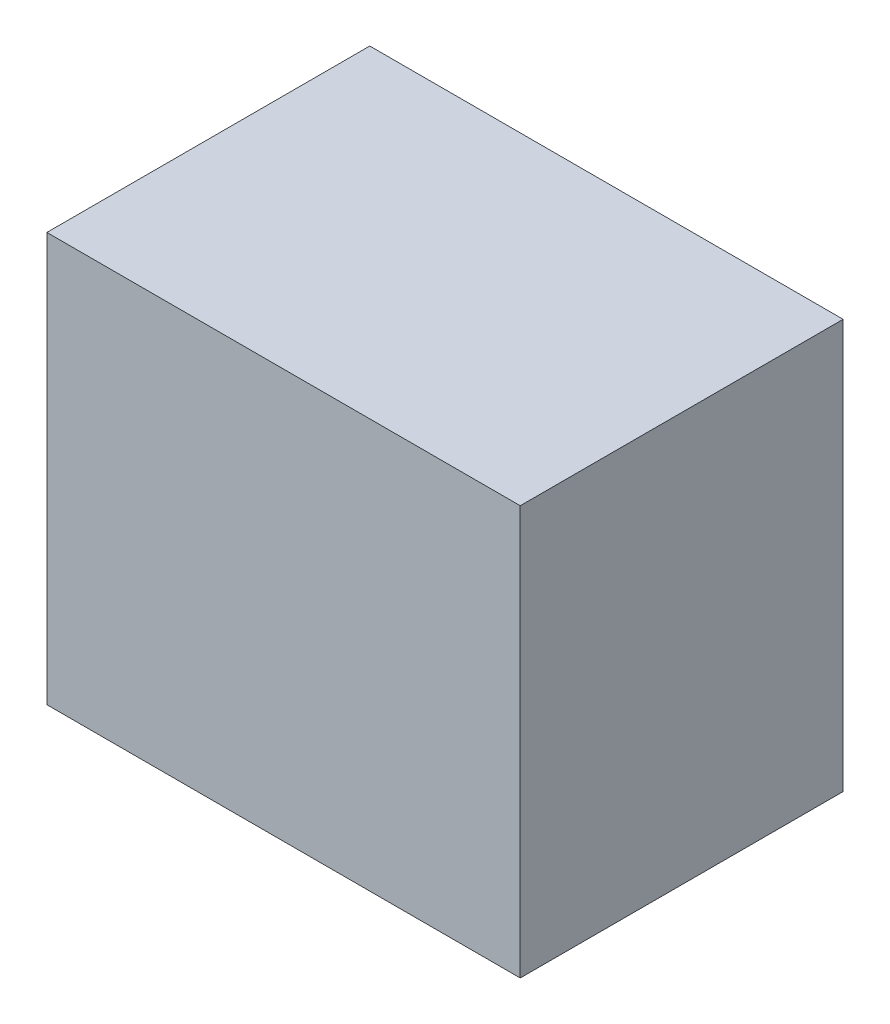
ISO-10303-21;
HEADER;
FILE_DESCRIPTION(('STEP AP214'),'2;1');
FILE_NAME('part.step','',(''),(''),'','','');
FILE_SCHEMA(('AUTOMOTIVE_DESIGN { 1 0 10303 214 1 1 1 1 }'));
ENDSEC;
DATA;
#1=APPLICATION_CONTEXT('core data for automotive mechanical design processes');
#2=APPLICATION_PROTOCOL_DEFINITION('international standard','automotive_design',2000,#1);
#3=PRODUCT_CONTEXT('',#1,'mechanical');
#4=PRODUCT('Part','Part','',(#3));
#5=PRODUCT_RELATED_PRODUCT_CATEGORY('part','',(#4));
#6=PRODUCT_DEFINITION_FORMATION('','',#4);
#7=PRODUCT_DEFINITION_CONTEXT('part definition',#1,'design');
#8=PRODUCT_DEFINITION('design','',#6,#7);
#9=PRODUCT_DEFINITION_SHAPE('','',#8);
#10=(LENGTH_UNIT() NAMED_UNIT(*) SI_UNIT(.MILLI.,.METRE.));
#11=(NAMED_UNIT(*) PLANE_ANGLE_UNIT() SI_UNIT($,.RADIAN.));
#12=(NAMED_UNIT(*) SI_UNIT($,.STERADIAN.) SOLID_ANGLE_UNIT());
#13=UNCERTAINTY_MEASURE_WITH_UNIT(LENGTH_MEASURE(1.E-05),#10,'distance_accuracy_value','');
#14=(GEOMETRIC_REPRESENTATION_CONTEXT(3) GLOBAL_UNCERTAINTY_ASSIGNED_CONTEXT((#13)) GLOBAL_UNIT_ASSIGNED_CONTEXT((#10,
#11,#12)) REPRESENTATION_CONTEXT('',''));
#15=CARTESIAN_POINT('',(0.,0.,0.));
#16=DIRECTION('',(0.,0.,1.));
#17=DIRECTION('',(1.,0.,0.));
#18=AXIS2_PLACEMENT_3D('',#15,#16,#17);
#19=CARTESIAN_POINT('',(0.,0.,0.));
#20=DIRECTION('',(0.,0.,1.));
#21=DIRECTION('',(1.,0.,0.));
#22=AXIS2_PLACEMENT_3D('',#19,#20,#21);
#23=PLANE('',#22);
#24=DIRECTION('',(0.,1.,0.));
#25=VECTOR('',#24,1.);
#26=CARTESIAN_POINT('',(-7.3021338321269,15.3,0.));
#27=LINE('',#26,#25);
#28=CARTESIAN_POINT('',(-7.3021338321269,19.1,0.));
#29=VERTEX_POINT('',#28);
#30=CARTESIAN_POINT('',(-7.3021338321269,15.3,0.));
#31=VERTEX_POINT('',#30);
#32=EDGE_CURVE('E58',#29,#31,#27,.F.);
#33=ORIENTED_EDGE('',*,*,#32,.F.);
#34=DIRECTION('',(1.,0.,0.));
#35=VECTOR('',#34,1.);
#36=CARTESIAN_POINT('',(-7.3021338321269,19.1,0.));
#37=LINE('',#36,#35);
#38=CARTESIAN_POINT('',(-11.7,19.1,0.));
#39=VERTEX_POINT('',#38);
#40=EDGE_CURVE('E53',#39,#29,#37,.T.);
#41=ORIENTED_EDGE('',*,*,#40,.F.);
#42=DIRECTION('',(0.,-1.,0.));
#43=VECTOR('',#42,1.);
#44=CARTESIAN_POINT('',(-11.7,19.1,0.));
#45=LINE('',#44,#43);
#46=CARTESIAN_POINT('',(-11.7,15.3,0.));
#47=VERTEX_POINT('',#46);
#48=EDGE_CURVE('E68',#47,#39,#45,.F.);
#49=ORIENTED_EDGE('',*,*,#48,.F.);
#50=DIRECTION('',(1.,0.,0.));
#51=VECTOR('',#50,1.);
#52=CARTESIAN_POINT('',(-11.7,15.3,0.));
#53=LINE('',#52,#51);
#54=EDGE_CURVE('E20',#31,#47,#53,.F.);
#55=ORIENTED_EDGE('',*,*,#54,.F.);
#56=EDGE_LOOP('',(#33,#41,#49,#55));
#57=FACE_BOUND('',#56,.T.);
#58=ADVANCED_FACE('F17',(#57),#23,.T.);
#59=CARTESIAN_POINT('',(-11.7,15.3,-3.));
#60=DIRECTION('',(0.,-1.,0.));
#61=DIRECTION('',(0.,0.,-1.));
#62=AXIS2_PLACEMENT_3D('',#59,#60,#61);
#63=PLANE('',#62);
#64=DIRECTION('',(1.,0.,0.));
#65=VECTOR('',#64,1.);
#66=CARTESIAN_POINT('',(0.,15.3,-3.));
#67=LINE('',#66,#65);
#68=CARTESIAN_POINT('',(-11.7,15.3,-3.));
#69=VERTEX_POINT('',#68);
#70=CARTESIAN_POINT('',(-7.3021338321269,15.3,-3.));
#71=VERTEX_POINT('',#70);
#72=EDGE_CURVE('E74',#69,#71,#67,.T.);
#73=ORIENTED_EDGE('',*,*,#72,.T.);
#74=DIRECTION('',(0.,0.,-1.));
#75=VECTOR('',#74,1.);
#76=CARTESIAN_POINT('',(-7.3021338321269,15.3,-3.));
#77=LINE('',#76,#75);
#78=EDGE_CURVE('E63',#31,#71,#77,.T.);
#79=ORIENTED_EDGE('',*,*,#78,.F.);
#80=ORIENTED_EDGE('',*,*,#54,.T.);
#81=DIRECTION('',(0.,0.,1.));
#82=VECTOR('',#81,1.);
#83=CARTESIAN_POINT('',(-11.7,15.3,-3.));
#84=LINE('',#83,#82);
#85=EDGE_CURVE('E81',#69,#47,#84,.T.);
#86=ORIENTED_EDGE('',*,*,#85,.F.);
#87=EDGE_LOOP('',(#73,#79,#80,#86));
#88=FACE_BOUND('',#87,.T.);
#89=ADVANCED_FACE('F73',(#88),#63,.T.);
#90=CARTESIAN_POINT('',(-7.3021338321269,15.3,-3.));
#91=DIRECTION('',(1.,0.,0.));
#92=DIRECTION('',(0.,0.,-1.));
#93=AXIS2_PLACEMENT_3D('',#90,#91,#92);
#94=PLANE('',#93);
#95=DIRECTION('',(0.,1.,0.));
#96=VECTOR('',#95,1.);
#97=CARTESIAN_POINT('',(-7.3021338321269,0.,-3.));
#98=LINE('',#97,#96);
#99=CARTESIAN_POINT('',(-7.3021338321269,19.1,-3.));
#100=VERTEX_POINT('',#99);
#101=EDGE_CURVE('E84',#71,#100,#98,.T.);
#102=ORIENTED_EDGE('',*,*,#101,.T.);
#103=DIRECTION('',(0.,0.,1.));
#104=VECTOR('',#103,1.);
#105=CARTESIAN_POINT('',(-7.3021338321269,19.1,-3.));
#106=LINE('',#105,#104);
#107=EDGE_CURVE('E65',#29,#100,#106,.F.);
#108=ORIENTED_EDGE('',*,*,#107,.F.);
#109=ORIENTED_EDGE('',*,*,#32,.T.);
#110=ORIENTED_EDGE('',*,*,#78,.T.);
#111=EDGE_LOOP('',(#102,#108,#109,#110));
#112=FACE_BOUND('',#111,.T.);
#113=ADVANCED_FACE('F61',(#112),#94,.T.);
#114=CARTESIAN_POINT('',(-7.3021338321269,19.1,-3.));
#115=DIRECTION('',(0.,1.,0.));
#116=DIRECTION('',(0.,0.,1.));
#117=AXIS2_PLACEMENT_3D('',#114,#115,#116);
#118=PLANE('',#117);
#119=DIRECTION('',(1.,0.,0.));
#120=VECTOR('',#119,1.);
#121=CARTESIAN_POINT('',(0.,19.1,-3.));
#122=LINE('',#121,#120);
#123=CARTESIAN_POINT('',(-11.7,19.1,-3.));
#124=VERTEX_POINT('',#123);
#125=EDGE_CURVE('E26',#100,#124,#122,.F.);
#126=ORIENTED_EDGE('',*,*,#125,.T.);
#127=DIRECTION('',(0.,0.,1.));
#128=VECTOR('',#127,1.);
#129=CARTESIAN_POINT('',(-11.7,19.1,-3.));
#130=LINE('',#129,#128);
#131=EDGE_CURVE('E34',#39,#124,#130,.F.);
#132=ORIENTED_EDGE('',*,*,#131,.F.);
#133=ORIENTED_EDGE('',*,*,#40,.T.);
#134=ORIENTED_EDGE('',*,*,#107,.T.);
#135=EDGE_LOOP('',(#126,#132,#133,#134));
#136=FACE_BOUND('',#135,.T.);
#137=ADVANCED_FACE('F88',(#136),#118,.T.);
#138=CARTESIAN_POINT('',(-11.7,19.1,-3.));
#139=DIRECTION('',(-1.,0.,0.));
#140=DIRECTION('',(0.,-1.,0.));
#141=AXIS2_PLACEMENT_3D('',#138,#139,#140);
#142=PLANE('',#141);
#143=DIRECTION('',(0.,1.,0.));
#144=VECTOR('',#143,1.);
#145=CARTESIAN_POINT('',(-11.7,0.,-3.));
#146=LINE('',#145,#144);
#147=EDGE_CURVE('E11',#124,#69,#146,.F.);
#148=ORIENTED_EDGE('',*,*,#147,.T.);
#149=ORIENTED_EDGE('',*,*,#85,.T.);
#150=ORIENTED_EDGE('',*,*,#48,.T.);
#151=ORIENTED_EDGE('',*,*,#131,.T.);
#152=EDGE_LOOP('',(#148,#149,#150,#151));
#153=FACE_BOUND('',#152,.T.);
#154=ADVANCED_FACE('F91',(#153),#142,.T.);
#155=CARTESIAN_POINT('',(0.,0.,-3.));
#156=DIRECTION('',(0.,0.,1.));
#157=DIRECTION('',(1.,0.,0.));
#158=AXIS2_PLACEMENT_3D('',#155,#156,#157);
#159=PLANE('',#158);
#160=ORIENTED_EDGE('',*,*,#125,.F.);
#161=ORIENTED_EDGE('',*,*,#101,.F.);
#162=ORIENTED_EDGE('',*,*,#72,.F.);
#163=ORIENTED_EDGE('',*,*,#147,.F.);
#164=EDGE_LOOP('',(#160,#161,#162,#163));
#165=FACE_BOUND('',#164,.T.);
#166=ADVANCED_FACE('F90',(#165),#159,.F.);
#167=CLOSED_SHELL('',(#58,#89,#113,#137,#154,#166));
#168=MANIFOLD_SOLID_BREP('B1',#167);
#169=ADVANCED_BREP_SHAPE_REPRESENTATION('',(#18,#168),#14);
#170=SHAPE_DEFINITION_REPRESENTATION(#9,#169);
ENDSEC;
END-ISO-10303-21;
